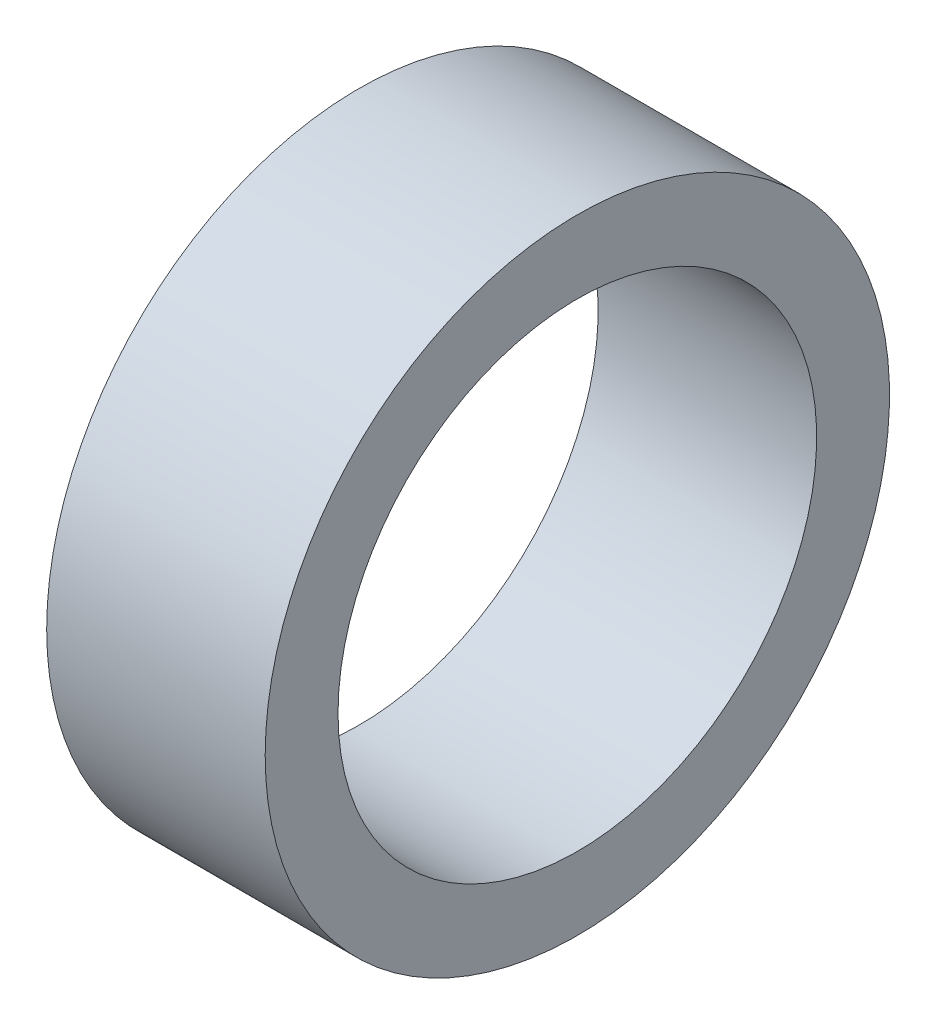
ISO-10303-21;
HEADER;
FILE_DESCRIPTION(('STEP AP214'),'2;1');
FILE_NAME('part.step','',(''),(''),'','','');
FILE_SCHEMA(('AUTOMOTIVE_DESIGN { 1 0 10303 214 1 1 1 1 }'));
ENDSEC;
DATA;
#1=APPLICATION_CONTEXT('core data for automotive mechanical design processes');
#2=APPLICATION_PROTOCOL_DEFINITION('international standard','automotive_design',2000,#1);
#3=PRODUCT_CONTEXT('',#1,'mechanical');
#4=PRODUCT('Part','Part','',(#3));
#5=PRODUCT_RELATED_PRODUCT_CATEGORY('part','',(#4));
#6=PRODUCT_DEFINITION_FORMATION('','',#4);
#7=PRODUCT_DEFINITION_CONTEXT('part definition',#1,'design');
#8=PRODUCT_DEFINITION('design','',#6,#7);
#9=PRODUCT_DEFINITION_SHAPE('','',#8);
#10=(LENGTH_UNIT() NAMED_UNIT(*) SI_UNIT(.MILLI.,.METRE.));
#11=(NAMED_UNIT(*) PLANE_ANGLE_UNIT() SI_UNIT($,.RADIAN.));
#12=(NAMED_UNIT(*) SI_UNIT($,.STERADIAN.) SOLID_ANGLE_UNIT());
#13=UNCERTAINTY_MEASURE_WITH_UNIT(LENGTH_MEASURE(1.E-05),#10,'distance_accuracy_value','');
#14=(GEOMETRIC_REPRESENTATION_CONTEXT(3) GLOBAL_UNCERTAINTY_ASSIGNED_CONTEXT((#13)) GLOBAL_UNIT_ASSIGNED_CONTEXT((#10,
#11,#12)) REPRESENTATION_CONTEXT('',''));
#15=CARTESIAN_POINT('',(0.,0.,0.));
#16=DIRECTION('',(0.,0.,1.));
#17=DIRECTION('',(1.,0.,0.));
#18=AXIS2_PLACEMENT_3D('',#15,#16,#17);
#19=CARTESIAN_POINT('',(21.,0.,0.));
#20=DIRECTION('',(-1.,0.,0.));
#21=DIRECTION('',(0.,0.,1.));
#22=AXIS2_PLACEMENT_3D('',#19,#20,#21);
#23=CYLINDRICAL_SURFACE('',#22,23.);
#24=CARTESIAN_POINT('',(0.,0.,0.));
#25=DIRECTION('',(-1.,0.,0.));
#26=DIRECTION('',(0.,0.,1.));
#27=AXIS2_PLACEMENT_3D('',#24,#25,#26);
#28=CIRCLE('',#27,23.);
#29=CARTESIAN_POINT('',(0.,0.,23.));
#30=VERTEX_POINT('',#29);
#31=EDGE_CURVE('E26',#30,#30,#28,.T.);
#32=ORIENTED_EDGE('',*,*,#31,.T.);
#33=EDGE_LOOP('',(#32));
#34=FACE_BOUND('',#33,.T.);
#35=CARTESIAN_POINT('',(21.,0.,0.));
#36=DIRECTION('',(-1.,0.,0.));
#37=DIRECTION('',(0.,0.,1.));
#38=AXIS2_PLACEMENT_3D('',#35,#36,#37);
#39=CIRCLE('',#38,23.);
#40=CARTESIAN_POINT('',(21.,0.,23.));
#41=VERTEX_POINT('',#40);
#42=EDGE_CURVE('E17',#41,#41,#39,.T.);
#43=ORIENTED_EDGE('',*,*,#42,.F.);
#44=EDGE_LOOP('',(#43));
#45=FACE_BOUND('',#44,.T.);
#46=ADVANCED_FACE('F14',(#34,#45),#23,.F.);
#47=CARTESIAN_POINT('',(21.,0.,0.));
#48=DIRECTION('',(1.,0.,0.));
#49=DIRECTION('',(0.,0.,-1.));
#50=AXIS2_PLACEMENT_3D('',#47,#48,#49);
#51=PLANE('',#50);
#52=ORIENTED_EDGE('',*,*,#42,.T.);
#53=EDGE_LOOP('',(#52));
#54=FACE_BOUND('',#53,.T.);
#55=CARTESIAN_POINT('',(21.,0.,0.));
#56=DIRECTION('',(-1.,0.,0.));
#57=DIRECTION('',(0.,0.,1.));
#58=AXIS2_PLACEMENT_3D('',#55,#56,#57);
#59=CIRCLE('',#58,30.);
#60=CARTESIAN_POINT('',(21.,0.,30.));
#61=VERTEX_POINT('',#60);
#62=EDGE_CURVE('E21',#61,#61,#59,.T.);
#63=ORIENTED_EDGE('',*,*,#62,.F.);
#64=EDGE_LOOP('',(#63));
#65=FACE_BOUND('',#64,.T.);
#66=ADVANCED_FACE('F34',(#54,#65),#51,.T.);
#67=CARTESIAN_POINT('',(0.,0.,0.));
#68=DIRECTION('',(1.,0.,0.));
#69=DIRECTION('',(0.,0.,-1.));
#70=AXIS2_PLACEMENT_3D('',#67,#68,#69);
#71=PLANE('',#70);
#72=ORIENTED_EDGE('',*,*,#31,.F.);
#73=EDGE_LOOP('',(#72));
#74=FACE_BOUND('',#73,.T.);
#75=CARTESIAN_POINT('',(0.,0.,0.));
#76=DIRECTION('',(-1.,0.,0.));
#77=DIRECTION('',(0.,0.,1.));
#78=AXIS2_PLACEMENT_3D('',#75,#76,#77);
#79=CIRCLE('',#78,30.);
#80=CARTESIAN_POINT('',(0.,0.,30.));
#81=VERTEX_POINT('',#80);
#82=EDGE_CURVE('E10',#81,#81,#79,.F.);
#83=ORIENTED_EDGE('',*,*,#82,.F.);
#84=EDGE_LOOP('',(#83));
#85=FACE_BOUND('',#84,.T.);
#86=ADVANCED_FACE('F42',(#74,#85),#71,.F.);
#87=CARTESIAN_POINT('',(21.,0.,0.));
#88=DIRECTION('',(-1.,0.,0.));
#89=DIRECTION('',(0.,0.,1.));
#90=AXIS2_PLACEMENT_3D('',#87,#88,#89);
#91=CYLINDRICAL_SURFACE('',#90,30.);
#92=ORIENTED_EDGE('',*,*,#82,.T.);
#93=EDGE_LOOP('',(#92));
#94=FACE_BOUND('',#93,.T.);
#95=ORIENTED_EDGE('',*,*,#62,.T.);
#96=EDGE_LOOP('',(#95));
#97=FACE_BOUND('',#96,.T.);
#98=ADVANCED_FACE('F43',(#94,#97),#91,.T.);
#99=CLOSED_SHELL('',(#46,#66,#86,#98));
#100=MANIFOLD_SOLID_BREP('B1',#99);
#101=ADVANCED_BREP_SHAPE_REPRESENTATION('',(#18,#100),#14);
#102=SHAPE_DEFINITION_REPRESENTATION(#9,#101);
ENDSEC;
END-ISO-10303-21;
